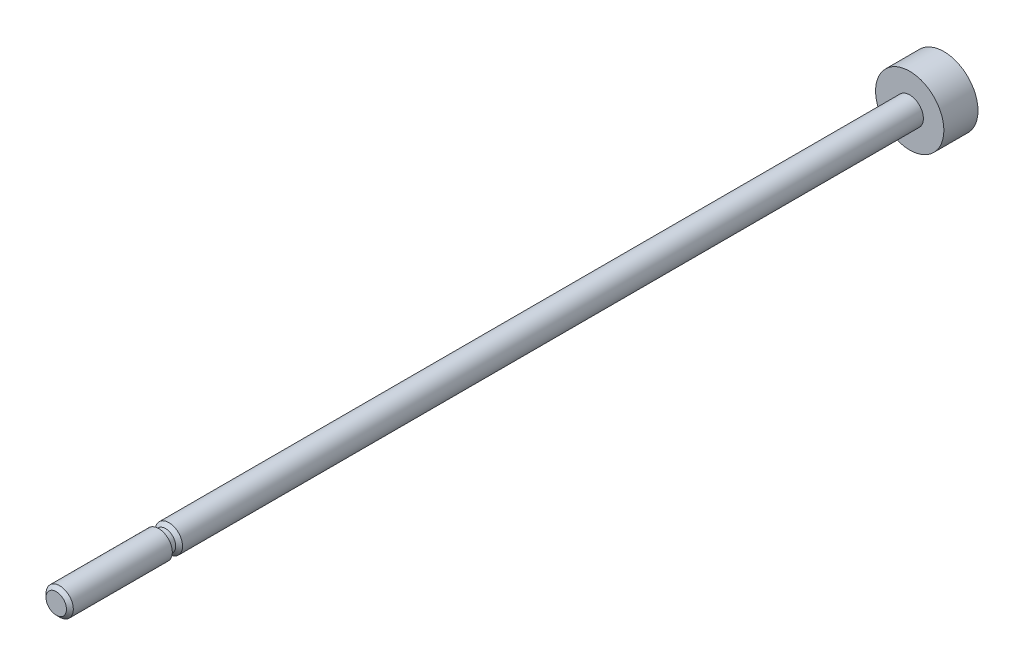
ISO-10303-21;
HEADER;
FILE_DESCRIPTION(('STEP AP214'),'2;1');
FILE_NAME('part.step','',(''),(''),'','','');
FILE_SCHEMA(('AUTOMOTIVE_DESIGN { 1 0 10303 214 1 1 1 1 }'));
ENDSEC;
DATA;
#1=APPLICATION_CONTEXT('core data for automotive mechanical design processes');
#2=APPLICATION_PROTOCOL_DEFINITION('international standard','automotive_design',2000,#1);
#3=PRODUCT_CONTEXT('',#1,'mechanical');
#4=PRODUCT('Part','Part','',(#3));
#5=PRODUCT_RELATED_PRODUCT_CATEGORY('part','',(#4));
#6=PRODUCT_DEFINITION_FORMATION('','',#4);
#7=PRODUCT_DEFINITION_CONTEXT('part definition',#1,'design');
#8=PRODUCT_DEFINITION('design','',#6,#7);
#9=PRODUCT_DEFINITION_SHAPE('','',#8);
#10=(LENGTH_UNIT() NAMED_UNIT(*) SI_UNIT(.MILLI.,.METRE.));
#11=(NAMED_UNIT(*) PLANE_ANGLE_UNIT() SI_UNIT($,.RADIAN.));
#12=(NAMED_UNIT(*) SI_UNIT($,.STERADIAN.) SOLID_ANGLE_UNIT());
#13=UNCERTAINTY_MEASURE_WITH_UNIT(LENGTH_MEASURE(1.E-05),#10,'distance_accuracy_value','');
#14=(GEOMETRIC_REPRESENTATION_CONTEXT(3) GLOBAL_UNCERTAINTY_ASSIGNED_CONTEXT((#13)) GLOBAL_UNIT_ASSIGNED_CONTEXT((#10,
#11,#12)) REPRESENTATION_CONTEXT('',''));
#15=CARTESIAN_POINT('',(0.,0.,0.));
#16=DIRECTION('',(0.,0.,1.));
#17=DIRECTION('',(1.,0.,0.));
#18=AXIS2_PLACEMENT_3D('',#15,#16,#17);
#19=CARTESIAN_POINT('',(0.,0.,135.656854249492));
#20=DIRECTION('',(0.,0.,-1.));
#21=DIRECTION('',(-1.,0.,0.));
#22=AXIS2_PLACEMENT_3D('',#19,#20,#21);
#23=CYLINDRICAL_SURFACE('',#22,2.);
#24=CARTESIAN_POINT('',(0.,0.,113.5));
#25=DIRECTION('',(0.,0.,-1.));
#26=DIRECTION('',(-1.,0.,0.));
#27=AXIS2_PLACEMENT_3D('',#24,#25,#26);
#28=CIRCLE('',#27,2.);
#29=CARTESIAN_POINT('',(-2.,0.,113.5));
#30=VERTEX_POINT('',#29);
#31=EDGE_CURVE('E10',#30,#30,#28,.T.);
#32=ORIENTED_EDGE('',*,*,#31,.T.);
#33=EDGE_LOOP('',(#32));
#34=FACE_BOUND('',#33,.T.);
#35=CARTESIAN_POINT('',(0.,0.,5.));
#36=DIRECTION('',(0.,0.,1.));
#37=DIRECTION('',(1.,0.,0.));
#38=AXIS2_PLACEMENT_3D('',#35,#36,#37);
#39=CIRCLE('',#38,2.);
#40=CARTESIAN_POINT('',(2.,0.,5.));
#41=VERTEX_POINT('',#40);
#42=EDGE_CURVE('E22',#41,#41,#39,.T.);
#43=ORIENTED_EDGE('',*,*,#42,.T.);
#44=EDGE_LOOP('',(#43));
#45=FACE_BOUND('',#44,.T.);
#46=ADVANCED_FACE('F15',(#34,#45),#23,.T.);
#47=CARTESIAN_POINT('',(0.,0.,5.));
#48=DIRECTION('',(0.,0.,-1.));
#49=DIRECTION('',(-1.,0.,0.));
#50=AXIS2_PLACEMENT_3D('',#47,#48,#49);
#51=CYLINDRICAL_SURFACE('',#50,5.);
#52=CARTESIAN_POINT('',(0.,0.,5.));
#53=DIRECTION('',(0.,0.,1.));
#54=DIRECTION('',(1.,0.,0.));
#55=AXIS2_PLACEMENT_3D('',#52,#53,#54);
#56=CIRCLE('',#55,5.);
#57=CARTESIAN_POINT('',(5.,0.,5.));
#58=VERTEX_POINT('',#57);
#59=EDGE_CURVE('E27',#58,#58,#56,.T.);
#60=ORIENTED_EDGE('',*,*,#59,.F.);
#61=EDGE_LOOP('',(#60));
#62=FACE_BOUND('',#61,.T.);
#63=CARTESIAN_POINT('',(0.,0.,0.));
#64=DIRECTION('',(0.,0.,1.));
#65=DIRECTION('',(1.,0.,0.));
#66=AXIS2_PLACEMENT_3D('',#63,#64,#65);
#67=CIRCLE('',#66,5.);
#68=CARTESIAN_POINT('',(5.,0.,0.));
#69=VERTEX_POINT('',#68);
#70=EDGE_CURVE('E33',#69,#69,#67,.T.);
#71=ORIENTED_EDGE('',*,*,#70,.T.);
#72=EDGE_LOOP('',(#71));
#73=FACE_BOUND('',#72,.T.);
#74=ADVANCED_FACE('F80',(#62,#73),#51,.T.);
#75=CARTESIAN_POINT('',(0.,0.,5.));
#76=DIRECTION('',(0.,0.,1.));
#77=DIRECTION('',(1.,0.,0.));
#78=AXIS2_PLACEMENT_3D('',#75,#76,#77);
#79=PLANE('',#78);
#80=ORIENTED_EDGE('',*,*,#42,.F.);
#81=EDGE_LOOP('',(#80));
#82=FACE_BOUND('',#81,.T.);
#83=ORIENTED_EDGE('',*,*,#59,.T.);
#84=EDGE_LOOP('',(#83));
#85=FACE_BOUND('',#84,.T.);
#86=ADVANCED_FACE('F82',(#82,#85),#79,.T.);
#87=CARTESIAN_POINT('',(0.,0.,0.));
#88=DIRECTION('',(0.,0.,1.));
#89=DIRECTION('',(1.,0.,0.));
#90=AXIS2_PLACEMENT_3D('',#87,#88,#89);
#91=PLANE('',#90);
#92=ORIENTED_EDGE('',*,*,#70,.F.);
#93=EDGE_LOOP('',(#92));
#94=FACE_BOUND('',#93,.T.);
#95=ADVANCED_FACE('F88',(#94),#91,.F.);
#96=CARTESIAN_POINT('',(0.,2.,115.));
#97=DIRECTION('',(0.,0.,1.));
#98=DIRECTION('',(1.,0.,0.));
#99=AXIS2_PLACEMENT_3D('',#96,#97,#98);
#100=PLANE('',#99);
#101=CARTESIAN_POINT('',(0.,0.,115.));
#102=DIRECTION('',(0.,0.,-1.));
#103=DIRECTION('',(-1.,0.,0.));
#104=AXIS2_PLACEMENT_3D('',#101,#102,#103);
#105=CIRCLE('',#104,1.5);
#106=CARTESIAN_POINT('',(-1.5,0.,115.));
#107=VERTEX_POINT('',#106);
#108=EDGE_CURVE('E49',#107,#107,#105,.T.);
#109=ORIENTED_EDGE('',*,*,#108,.F.);
#110=EDGE_LOOP('',(#109));
#111=FACE_BOUND('',#110,.T.);
#112=CARTESIAN_POINT('',(0.,0.,115.));
#113=DIRECTION('',(0.,0.,-1.));
#114=DIRECTION('',(-1.,0.,0.));
#115=AXIS2_PLACEMENT_3D('',#112,#113,#114);
#116=CIRCLE('',#115,2.);
#117=CARTESIAN_POINT('',(-2.,0.,115.));
#118=VERTEX_POINT('',#117);
#119=EDGE_CURVE('E35',#118,#118,#116,.T.);
#120=ORIENTED_EDGE('',*,*,#119,.T.);
#121=EDGE_LOOP('',(#120));
#122=FACE_BOUND('',#121,.T.);
#123=ADVANCED_FACE('F60',(#111,#122),#100,.F.);
#124=CARTESIAN_POINT('',(0.,0.,0.));
#125=DIRECTION('',(0.,0.,-1.));
#126=DIRECTION('',(-1.,0.,0.));
#127=AXIS2_PLACEMENT_3D('',#124,#125,#126);
#128=CYLINDRICAL_SURFACE('',#127,1.5);
#129=CARTESIAN_POINT('',(0.,0.,114.));
#130=DIRECTION('',(0.,0.,-1.));
#131=DIRECTION('',(-1.,0.,0.));
#132=AXIS2_PLACEMENT_3D('',#129,#130,#131);
#133=CIRCLE('',#132,1.5);
#134=CARTESIAN_POINT('',(-1.5,0.,114.));
#135=VERTEX_POINT('',#134);
#136=EDGE_CURVE('E48',#135,#135,#133,.T.);
#137=ORIENTED_EDGE('',*,*,#136,.F.);
#138=EDGE_LOOP('',(#137));
#139=FACE_BOUND('',#138,.T.);
#140=ORIENTED_EDGE('',*,*,#108,.T.);
#141=EDGE_LOOP('',(#140));
#142=FACE_BOUND('',#141,.T.);
#143=ADVANCED_FACE('F62',(#139,#142),#128,.T.);
#144=CARTESIAN_POINT('',(0.,0.,129.5));
#145=DIRECTION('',(0.,0.,-1.));
#146=DIRECTION('',(-1.,0.,0.));
#147=AXIS2_PLACEMENT_3D('',#144,#145,#146);
#148=CIRCLE('',#147,2.);
#149=CARTESIAN_POINT('',(-2.,0.,129.5));
#150=VERTEX_POINT('',#149);
#151=EDGE_CURVE('E40',#150,#150,#148,.T.);
#152=ORIENTED_EDGE('',*,*,#151,.T.);
#153=EDGE_LOOP('',(#152));
#154=FACE_BOUND('',#153,.T.);
#155=ORIENTED_EDGE('',*,*,#119,.F.);
#156=EDGE_LOOP('',(#155));
#157=FACE_BOUND('',#156,.T.);
#158=ADVANCED_FACE('F56',(#154,#157),#23,.T.);
#159=CARTESIAN_POINT('',(0.,0.,130.));
#160=DIRECTION('',(0.,0.,-1.));
#161=DIRECTION('',(-1.,0.,0.));
#162=AXIS2_PLACEMENT_3D('',#159,#160,#161);
#163=CONICAL_SURFACE('',#162,1.5,0.785398163397476);
#164=ORIENTED_EDGE('',*,*,#151,.F.);
#165=EDGE_LOOP('',(#164));
#166=FACE_BOUND('',#165,.T.);
#167=CARTESIAN_POINT('',(0.,0.,130.));
#168=DIRECTION('',(0.,0.,-1.));
#169=DIRECTION('',(-1.,0.,0.));
#170=AXIS2_PLACEMENT_3D('',#167,#168,#169);
#171=CIRCLE('',#170,1.5);
#172=CARTESIAN_POINT('',(-1.5,0.,130.));
#173=VERTEX_POINT('',#172);
#174=EDGE_CURVE('E41',#173,#173,#171,.T.);
#175=ORIENTED_EDGE('',*,*,#174,.T.);
#176=EDGE_LOOP('',(#175));
#177=FACE_BOUND('',#176,.T.);
#178=ADVANCED_FACE('F61',(#166,#177),#163,.T.);
#179=CARTESIAN_POINT('',(0.,0.,130.));
#180=DIRECTION('',(0.,0.,1.));
#181=DIRECTION('',(1.,0.,0.));
#182=AXIS2_PLACEMENT_3D('',#179,#180,#181);
#183=PLANE('',#182);
#184=ORIENTED_EDGE('',*,*,#174,.F.);
#185=EDGE_LOOP('',(#184));
#186=FACE_BOUND('',#185,.T.);
#187=ADVANCED_FACE('F68',(#186),#183,.T.);
#188=CARTESIAN_POINT('',(0.,0.,113.5));
#189=DIRECTION('',(0.,0.,-1.));
#190=DIRECTION('',(-1.,0.,0.));
#191=AXIS2_PLACEMENT_3D('',#188,#189,#190);
#192=CONICAL_SURFACE('',#191,2.,0.78539816339746);
#193=ORIENTED_EDGE('',*,*,#136,.T.);
#194=EDGE_LOOP('',(#193));
#195=FACE_BOUND('',#194,.T.);
#196=ORIENTED_EDGE('',*,*,#31,.F.);
#197=EDGE_LOOP('',(#196));
#198=FACE_BOUND('',#197,.T.);
#199=ADVANCED_FACE('F17',(#195,#198),#192,.T.);
#200=CLOSED_SHELL('',(#46,#74,#86,#95,#123,#143,#158,#178,#187,#199));
#201=MANIFOLD_SOLID_BREP('B1',#200);
#202=ADVANCED_BREP_SHAPE_REPRESENTATION('',(#18,#201),#14);
#203=SHAPE_DEFINITION_REPRESENTATION(#9,#202);
ENDSEC;
END-ISO-10303-21;
